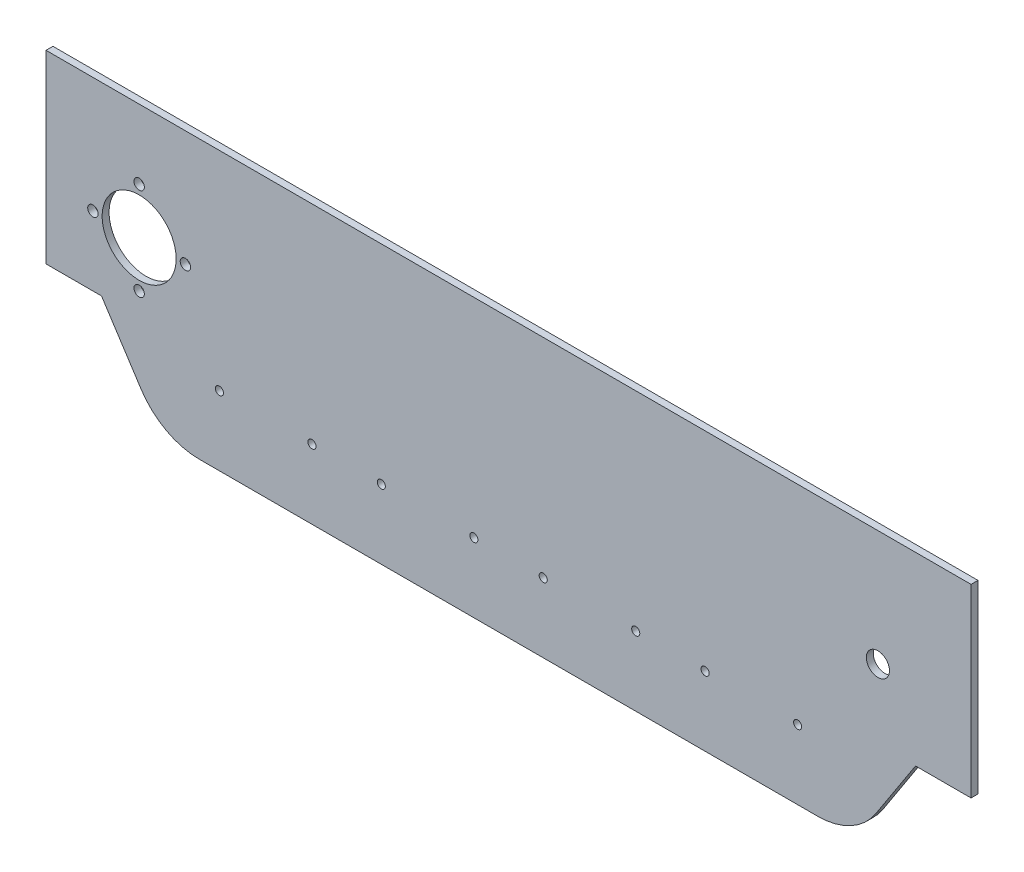
ISO-10303-21;
HEADER;
FILE_DESCRIPTION(('STEP AP214'),'2;1');
FILE_NAME('part.step','',(''),(''),'','','');
FILE_SCHEMA(('AUTOMOTIVE_DESIGN { 1 0 10303 214 1 1 1 1 }'));
ENDSEC;
DATA;
#1=APPLICATION_CONTEXT('core data for automotive mechanical design processes');
#2=APPLICATION_PROTOCOL_DEFINITION('international standard','automotive_design',2000,#1);
#3=PRODUCT_CONTEXT('',#1,'mechanical');
#4=PRODUCT('Part','Part','',(#3));
#5=PRODUCT_RELATED_PRODUCT_CATEGORY('part','',(#4));
#6=PRODUCT_DEFINITION_FORMATION('','',#4);
#7=PRODUCT_DEFINITION_CONTEXT('part definition',#1,'design');
#8=PRODUCT_DEFINITION('design','',#6,#7);
#9=PRODUCT_DEFINITION_SHAPE('','',#8);
#10=(LENGTH_UNIT() NAMED_UNIT(*) SI_UNIT(.MILLI.,.METRE.));
#11=(NAMED_UNIT(*) PLANE_ANGLE_UNIT() SI_UNIT($,.RADIAN.));
#12=(NAMED_UNIT(*) SI_UNIT($,.STERADIAN.) SOLID_ANGLE_UNIT());
#13=UNCERTAINTY_MEASURE_WITH_UNIT(LENGTH_MEASURE(1.E-05),#10,'distance_accuracy_value','');
#14=(GEOMETRIC_REPRESENTATION_CONTEXT(3) GLOBAL_UNCERTAINTY_ASSIGNED_CONTEXT((#13)) GLOBAL_UNIT_ASSIGNED_CONTEXT((#10,
#11,#12)) REPRESENTATION_CONTEXT('',''));
#15=CARTESIAN_POINT('',(0.,0.,0.));
#16=DIRECTION('',(0.,0.,1.));
#17=DIRECTION('',(1.,0.,0.));
#18=AXIS2_PLACEMENT_3D('',#15,#16,#17);
#19=CARTESIAN_POINT('',(399.872727163389,53.6503494821376,3.));
#20=DIRECTION('',(-0.838443616300637,0.544988350595414,0.));
#21=DIRECTION('',(-0.544988350595414,-0.838443616300637,0.));
#22=AXIS2_PLACEMENT_3D('',#19,#20,#21);
#23=PLANE('',#22);
#24=DIRECTION('',(0.,0.,1.));
#25=VECTOR('',#24,1.);
#26=CARTESIAN_POINT('',(391.,40.,0.));
#27=LINE('',#26,#25);
#28=CARTESIAN_POINT('',(391.,40.,0.));
#29=VERTEX_POINT('',#28);
#30=CARTESIAN_POINT('',(391.,40.,3.));
#31=VERTEX_POINT('',#30);
#32=EDGE_CURVE('E46',#29,#31,#27,.T.);
#33=ORIENTED_EDGE('',*,*,#32,.T.);
#34=DIRECTION('',(0.544988350595414,0.838443616300637,0.));
#35=VECTOR('',#34,1.);
#36=CARTESIAN_POINT('',(399.872727163389,53.6503494821376,3.));
#37=LINE('',#36,#35);
#38=CARTESIAN_POINT('',(373.872727163389,13.6503494821376,3.));
#39=VERTEX_POINT('',#38);
#40=EDGE_CURVE('E209',#39,#31,#37,.T.);
#41=ORIENTED_EDGE('',*,*,#40,.F.);
#42=DIRECTION('',(0.,0.,-1.));
#43=VECTOR('',#42,1.);
#44=CARTESIAN_POINT('',(373.872727163389,13.6503494821376,3.));
#45=LINE('',#44,#43);
#46=CARTESIAN_POINT('',(373.872727163389,13.6503494821376,0.));
#47=VERTEX_POINT('',#46);
#48=EDGE_CURVE('E211',#39,#47,#45,.T.);
#49=ORIENTED_EDGE('',*,*,#48,.T.);
#50=DIRECTION('',(0.544988350595414,0.838443616300637,0.));
#51=VECTOR('',#50,1.);
#52=CARTESIAN_POINT('',(399.872727163389,53.6503494821376,0.));
#53=LINE('',#52,#51);
#54=EDGE_CURVE('E203',#47,#29,#53,.T.);
#55=ORIENTED_EDGE('',*,*,#54,.T.);
#56=EDGE_LOOP('',(#33,#41,#49,#55));
#57=FACE_BOUND('',#56,.T.);
#58=ADVANCED_FACE('F31',(#57),#23,.F.);
#59=CARTESIAN_POINT('',(56.1272728366106,13.6503494821376,3.));
#60=DIRECTION('',(0.838443616300637,0.544988350595414,0.));
#61=DIRECTION('',(-0.544988350595414,0.838443616300637,0.));
#62=AXIS2_PLACEMENT_3D('',#59,#60,#61);
#63=PLANE('',#62);
#64=DIRECTION('',(0.544988350595414,-0.838443616300637,0.));
#65=VECTOR('',#64,1.);
#66=CARTESIAN_POINT('',(56.1272728366106,13.6503494821376,3.));
#67=LINE('',#66,#65);
#68=CARTESIAN_POINT('',(39.,40.,3.));
#69=VERTEX_POINT('',#68);
#70=CARTESIAN_POINT('',(56.1272728366106,13.6503494821376,3.));
#71=VERTEX_POINT('',#70);
#72=EDGE_CURVE('E54',#69,#71,#67,.T.);
#73=ORIENTED_EDGE('',*,*,#72,.F.);
#74=DIRECTION('',(0.,0.,1.));
#75=VECTOR('',#74,1.);
#76=CARTESIAN_POINT('',(38.9999999999999,40.0000000000001,0.));
#77=LINE('',#76,#75);
#78=CARTESIAN_POINT('',(38.9999999999999,40.0000000000001,0.));
#79=VERTEX_POINT('',#78);
#80=EDGE_CURVE('E157',#79,#69,#77,.T.);
#81=ORIENTED_EDGE('',*,*,#80,.F.);
#82=DIRECTION('',(0.544988350595414,-0.838443616300637,0.));
#83=VECTOR('',#82,1.);
#84=CARTESIAN_POINT('',(56.1272728366106,13.6503494821376,0.));
#85=LINE('',#84,#83);
#86=CARTESIAN_POINT('',(56.1272728366106,13.6503494821376,0.));
#87=VERTEX_POINT('',#86);
#88=EDGE_CURVE('E198',#79,#87,#85,.T.);
#89=ORIENTED_EDGE('',*,*,#88,.T.);
#90=DIRECTION('',(0.,0.,-1.));
#91=VECTOR('',#90,1.);
#92=CARTESIAN_POINT('',(56.1272728366106,13.6503494821376,3.));
#93=LINE('',#92,#91);
#94=EDGE_CURVE('E11',#71,#87,#93,.T.);
#95=ORIENTED_EDGE('',*,*,#94,.F.);
#96=EDGE_LOOP('',(#73,#81,#89,#95));
#97=FACE_BOUND('',#96,.T.);
#98=ADVANCED_FACE('F33',(#97),#63,.F.);
#99=CARTESIAN_POINT('',(81.2805813256297,30.,3.));
#100=DIRECTION('',(0.,0.,-1.));
#101=DIRECTION('',(-1.,0.,0.));
#102=AXIS2_PLACEMENT_3D('',#99,#100,#101);
#103=CYLINDRICAL_SURFACE('',#102,30.);
#104=CARTESIAN_POINT('',(81.2805813256297,30.,0.));
#105=DIRECTION('',(0.,0.,1.));
#106=DIRECTION('',(-1.,0.,0.));
#107=AXIS2_PLACEMENT_3D('',#104,#105,#106);
#108=CIRCLE('',#107,30.);
#109=CARTESIAN_POINT('',(81.2805813256297,0.,0.));
#110=VERTEX_POINT('',#109);
#111=EDGE_CURVE('E213',#87,#110,#108,.T.);
#112=ORIENTED_EDGE('',*,*,#111,.T.);
#113=DIRECTION('',(0.,0.,-1.));
#114=VECTOR('',#113,1.);
#115=CARTESIAN_POINT('',(81.2805813256297,0.,3.));
#116=LINE('',#115,#114);
#117=CARTESIAN_POINT('',(81.2805813256297,0.,3.));
#118=VERTEX_POINT('',#117);
#119=EDGE_CURVE('E39',#118,#110,#116,.T.);
#120=ORIENTED_EDGE('',*,*,#119,.F.);
#121=CARTESIAN_POINT('',(81.2805813256297,30.,3.));
#122=DIRECTION('',(0.,0.,1.));
#123=DIRECTION('',(-1.,0.,0.));
#124=AXIS2_PLACEMENT_3D('',#121,#122,#123);
#125=CIRCLE('',#124,30.);
#126=EDGE_CURVE('E202',#71,#118,#125,.T.);
#127=ORIENTED_EDGE('',*,*,#126,.F.);
#128=ORIENTED_EDGE('',*,*,#94,.T.);
#129=EDGE_LOOP('',(#112,#120,#127,#128));
#130=FACE_BOUND('',#129,.T.);
#131=ADVANCED_FACE('F241',(#130),#103,.T.);
#132=CARTESIAN_POINT('',(348.71941867437,0.,3.));
#133=DIRECTION('',(0.,1.,0.));
#134=DIRECTION('',(0.,0.,1.));
#135=AXIS2_PLACEMENT_3D('',#132,#133,#134);
#136=PLANE('',#135);
#137=DIRECTION('',(1.,0.,0.));
#138=VECTOR('',#137,1.);
#139=CARTESIAN_POINT('',(348.71941867437,0.,0.));
#140=LINE('',#139,#138);
#141=CARTESIAN_POINT('',(348.71941867437,0.,0.));
#142=VERTEX_POINT('',#141);
#143=EDGE_CURVE('E215',#110,#142,#140,.T.);
#144=ORIENTED_EDGE('',*,*,#143,.T.);
#145=DIRECTION('',(0.,0.,-1.));
#146=VECTOR('',#145,1.);
#147=CARTESIAN_POINT('',(348.71941867437,0.,3.));
#148=LINE('',#147,#146);
#149=CARTESIAN_POINT('',(348.71941867437,0.,3.));
#150=VERTEX_POINT('',#149);
#151=EDGE_CURVE('E222',#150,#142,#148,.T.);
#152=ORIENTED_EDGE('',*,*,#151,.F.);
#153=DIRECTION('',(1.,0.,0.));
#154=VECTOR('',#153,1.);
#155=CARTESIAN_POINT('',(348.71941867437,0.,3.));
#156=LINE('',#155,#154);
#157=EDGE_CURVE('E205',#118,#150,#156,.T.);
#158=ORIENTED_EDGE('',*,*,#157,.F.);
#159=ORIENTED_EDGE('',*,*,#119,.T.);
#160=EDGE_LOOP('',(#144,#152,#158,#159));
#161=FACE_BOUND('',#160,.T.);
#162=ADVANCED_FACE('F229',(#161),#136,.F.);
#163=CARTESIAN_POINT('',(348.71941867437,30.,3.));
#164=DIRECTION('',(0.,0.,-1.));
#165=DIRECTION('',(-1.,0.,0.));
#166=AXIS2_PLACEMENT_3D('',#163,#164,#165);
#167=CYLINDRICAL_SURFACE('',#166,30.);
#168=CARTESIAN_POINT('',(348.71941867437,30.,0.));
#169=DIRECTION('',(0.,0.,1.));
#170=DIRECTION('',(-1.,0.,0.));
#171=AXIS2_PLACEMENT_3D('',#168,#169,#170);
#172=CIRCLE('',#171,30.);
#173=EDGE_CURVE('E217',#142,#47,#172,.T.);
#174=ORIENTED_EDGE('',*,*,#173,.T.);
#175=ORIENTED_EDGE('',*,*,#48,.F.);
#176=CARTESIAN_POINT('',(348.71941867437,30.,3.));
#177=DIRECTION('',(0.,0.,1.));
#178=DIRECTION('',(-1.,0.,0.));
#179=AXIS2_PLACEMENT_3D('',#176,#177,#178);
#180=CIRCLE('',#179,30.);
#181=EDGE_CURVE('E207',#150,#39,#180,.T.);
#182=ORIENTED_EDGE('',*,*,#181,.F.);
#183=ORIENTED_EDGE('',*,*,#151,.T.);
#184=EDGE_LOOP('',(#174,#175,#182,#183));
#185=FACE_BOUND('',#184,.T.);
#186=ADVANCED_FACE('F237',(#185),#167,.T.);
#187=CARTESIAN_POINT('',(55.2805813256297,70.,3.));
#188=DIRECTION('',(0.,0.,1.));
#189=DIRECTION('',(1.,0.,0.));
#190=AXIS2_PLACEMENT_3D('',#187,#188,#189);
#191=PLANE('',#190);
#192=CARTESIAN_POINT('',(300.,30.,3.));
#193=DIRECTION('',(0.,0.,1.));
#194=DIRECTION('',(1.,0.,0.));
#195=AXIS2_PLACEMENT_3D('',#192,#193,#194);
#196=CIRCLE('',#195,1.75);
#197=CARTESIAN_POINT('',(301.75,30.,3.));
#198=VERTEX_POINT('',#197);
#199=EDGE_CURVE('E462',#198,#198,#196,.T.);
#200=ORIENTED_EDGE('',*,*,#199,.F.);
#201=EDGE_LOOP('',(#200));
#202=FACE_BOUND('',#201,.T.);
#203=CARTESIAN_POINT('',(340.,30.,3.));
#204=DIRECTION('',(0.,0.,1.));
#205=DIRECTION('',(1.,0.,0.));
#206=AXIS2_PLACEMENT_3D('',#203,#204,#205);
#207=CIRCLE('',#206,1.75000000000001);
#208=CARTESIAN_POINT('',(341.75,30.,3.));
#209=VERTEX_POINT('',#208);
#210=EDGE_CURVE('E464',#209,#209,#207,.T.);
#211=ORIENTED_EDGE('',*,*,#210,.F.);
#212=EDGE_LOOP('',(#211));
#213=FACE_BOUND('',#212,.T.);
#214=CARTESIAN_POINT('',(230.,30.,3.));
#215=DIRECTION('',(0.,0.,1.));
#216=DIRECTION('',(1.,0.,0.));
#217=AXIS2_PLACEMENT_3D('',#214,#215,#216);
#218=CIRCLE('',#217,1.75);
#219=CARTESIAN_POINT('',(231.75,30.,3.));
#220=VERTEX_POINT('',#219);
#221=EDGE_CURVE('E470',#220,#220,#218,.T.);
#222=ORIENTED_EDGE('',*,*,#221,.F.);
#223=EDGE_LOOP('',(#222));
#224=FACE_BOUND('',#223,.T.);
#225=CARTESIAN_POINT('',(270.,30.,3.));
#226=DIRECTION('',(0.,0.,1.));
#227=DIRECTION('',(1.,0.,0.));
#228=AXIS2_PLACEMENT_3D('',#225,#226,#227);
#229=CIRCLE('',#228,1.75000000000001);
#230=CARTESIAN_POINT('',(271.75,30.,3.));
#231=VERTEX_POINT('',#230);
#232=EDGE_CURVE('E476',#231,#231,#229,.T.);
#233=ORIENTED_EDGE('',*,*,#232,.F.);
#234=EDGE_LOOP('',(#233));
#235=FACE_BOUND('',#234,.T.);
#236=CARTESIAN_POINT('',(160.,30.,3.));
#237=DIRECTION('',(0.,0.,1.));
#238=DIRECTION('',(1.,0.,0.));
#239=AXIS2_PLACEMENT_3D('',#236,#237,#238);
#240=CIRCLE('',#239,1.75);
#241=CARTESIAN_POINT('',(161.75,30.,3.));
#242=VERTEX_POINT('',#241);
#243=EDGE_CURVE('E482',#242,#242,#240,.T.);
#244=ORIENTED_EDGE('',*,*,#243,.F.);
#245=EDGE_LOOP('',(#244));
#246=FACE_BOUND('',#245,.T.);
#247=CARTESIAN_POINT('',(200.,30.,3.));
#248=DIRECTION('',(0.,0.,1.));
#249=DIRECTION('',(1.,0.,0.));
#250=AXIS2_PLACEMENT_3D('',#247,#248,#249);
#251=CIRCLE('',#250,1.75000000000001);
#252=CARTESIAN_POINT('',(201.75,30.,3.));
#253=VERTEX_POINT('',#252);
#254=EDGE_CURVE('E488',#253,#253,#251,.T.);
#255=ORIENTED_EDGE('',*,*,#254,.F.);
#256=EDGE_LOOP('',(#255));
#257=FACE_BOUND('',#256,.T.);
#258=CARTESIAN_POINT('',(90.,30.,3.));
#259=DIRECTION('',(0.,0.,1.));
#260=DIRECTION('',(1.,0.,0.));
#261=AXIS2_PLACEMENT_3D('',#258,#259,#260);
#262=CIRCLE('',#261,1.75);
#263=CARTESIAN_POINT('',(91.75,30.,3.));
#264=VERTEX_POINT('',#263);
#265=EDGE_CURVE('E494',#264,#264,#262,.T.);
#266=ORIENTED_EDGE('',*,*,#265,.F.);
#267=EDGE_LOOP('',(#266));
#268=FACE_BOUND('',#267,.T.);
#269=CARTESIAN_POINT('',(130.,30.,3.));
#270=DIRECTION('',(0.,0.,1.));
#271=DIRECTION('',(1.,0.,0.));
#272=AXIS2_PLACEMENT_3D('',#269,#270,#271);
#273=CIRCLE('',#272,1.75000000000001);
#274=CARTESIAN_POINT('',(131.75,30.,3.));
#275=VERTEX_POINT('',#274);
#276=EDGE_CURVE('E140',#275,#275,#273,.T.);
#277=ORIENTED_EDGE('',*,*,#276,.F.);
#278=EDGE_LOOP('',(#277));
#279=FACE_BOUND('',#278,.T.);
#280=CARTESIAN_POINT('',(374.71941867437,70.,3.));
#281=DIRECTION('',(0.,0.,1.));
#282=DIRECTION('',(1.,0.,0.));
#283=AXIS2_PLACEMENT_3D('',#280,#281,#282);
#284=CIRCLE('',#283,4.99999999999999);
#285=CARTESIAN_POINT('',(379.71941867437,70.,3.));
#286=VERTEX_POINT('',#285);
#287=EDGE_CURVE('E156',#286,#286,#284,.T.);
#288=ORIENTED_EDGE('',*,*,#287,.F.);
#289=EDGE_LOOP('',(#288));
#290=FACE_BOUND('',#289,.T.);
#291=CARTESIAN_POINT('',(35.2805813256297,70.,3.));
#292=DIRECTION('',(0.,0.,1.));
#293=DIRECTION('',(1.,0.,0.));
#294=AXIS2_PLACEMENT_3D('',#291,#292,#293);
#295=CIRCLE('',#294,2.25);
#296=CARTESIAN_POINT('',(37.5305813256297,70.,3.));
#297=VERTEX_POINT('',#296);
#298=EDGE_CURVE('E168',#297,#297,#295,.T.);
#299=ORIENTED_EDGE('',*,*,#298,.F.);
#300=EDGE_LOOP('',(#299));
#301=FACE_BOUND('',#300,.T.);
#302=CARTESIAN_POINT('',(55.2805813256297,50.,3.));
#303=DIRECTION('',(0.,0.,1.));
#304=DIRECTION('',(1.,0.,0.));
#305=AXIS2_PLACEMENT_3D('',#302,#303,#304);
#306=CIRCLE('',#305,2.25);
#307=CARTESIAN_POINT('',(57.5305813256297,50.,3.));
#308=VERTEX_POINT('',#307);
#309=EDGE_CURVE('E174',#308,#308,#306,.T.);
#310=ORIENTED_EDGE('',*,*,#309,.F.);
#311=EDGE_LOOP('',(#310));
#312=FACE_BOUND('',#311,.T.);
#313=CARTESIAN_POINT('',(75.2805813256297,70.,3.));
#314=DIRECTION('',(0.,0.,1.));
#315=DIRECTION('',(1.,0.,0.));
#316=AXIS2_PLACEMENT_3D('',#313,#314,#315);
#317=CIRCLE('',#316,2.25);
#318=CARTESIAN_POINT('',(77.5305813256297,70.,3.));
#319=VERTEX_POINT('',#318);
#320=EDGE_CURVE('E180',#319,#319,#317,.T.);
#321=ORIENTED_EDGE('',*,*,#320,.F.);
#322=EDGE_LOOP('',(#321));
#323=FACE_BOUND('',#322,.T.);
#324=CARTESIAN_POINT('',(55.2805813256297,90.,3.));
#325=DIRECTION('',(0.,0.,1.));
#326=DIRECTION('',(1.,0.,0.));
#327=AXIS2_PLACEMENT_3D('',#324,#325,#326);
#328=CIRCLE('',#327,2.25);
#329=CARTESIAN_POINT('',(57.5305813256297,90.,3.));
#330=VERTEX_POINT('',#329);
#331=EDGE_CURVE('E186',#330,#330,#328,.T.);
#332=ORIENTED_EDGE('',*,*,#331,.F.);
#333=EDGE_LOOP('',(#332));
#334=FACE_BOUND('',#333,.T.);
#335=CARTESIAN_POINT('',(55.2805813256297,70.,3.));
#336=DIRECTION('',(0.,0.,1.));
#337=DIRECTION('',(1.,0.,0.));
#338=AXIS2_PLACEMENT_3D('',#335,#336,#337);
#339=CIRCLE('',#338,16.);
#340=CARTESIAN_POINT('',(71.2805813256297,70.,3.));
#341=VERTEX_POINT('',#340);
#342=EDGE_CURVE('E192',#341,#341,#339,.T.);
#343=ORIENTED_EDGE('',*,*,#342,.F.);
#344=EDGE_LOOP('',(#343));
#345=FACE_BOUND('',#344,.T.);
#346=ORIENTED_EDGE('',*,*,#40,.T.);
#347=DIRECTION('',(-1.,0.,0.));
#348=VECTOR('',#347,1.);
#349=CARTESIAN_POINT('',(215.,39.9999999999999,3.));
#350=LINE('',#349,#348);
#351=CARTESIAN_POINT('',(415.,39.9999999999999,3.));
#352=VERTEX_POINT('',#351);
#353=EDGE_CURVE('E148',#352,#31,#350,.T.);
#354=ORIENTED_EDGE('',*,*,#353,.F.);
#355=DIRECTION('',(0.,-1.,0.));
#356=VECTOR('',#355,1.);
#357=CARTESIAN_POINT('',(415.,-264.967528681372,3.));
#358=LINE('',#357,#356);
#359=CARTESIAN_POINT('',(415.,120.,3.));
#360=VERTEX_POINT('',#359);
#361=EDGE_CURVE('E126',#360,#352,#358,.T.);
#362=ORIENTED_EDGE('',*,*,#361,.F.);
#363=DIRECTION('',(1.,0.,0.));
#364=VECTOR('',#363,1.);
#365=CARTESIAN_POINT('',(215.,120.,3.));
#366=LINE('',#365,#364);
#367=CARTESIAN_POINT('',(15.,120.,3.));
#368=VERTEX_POINT('',#367);
#369=EDGE_CURVE('E152',#368,#360,#366,.T.);
#370=ORIENTED_EDGE('',*,*,#369,.F.);
#371=DIRECTION('',(0.,1.,0.));
#372=VECTOR('',#371,1.);
#373=CARTESIAN_POINT('',(15.0000000000001,-264.967528681372,3.));
#374=LINE('',#373,#372);
#375=CARTESIAN_POINT('',(15.,39.9999999999999,3.));
#376=VERTEX_POINT('',#375);
#377=EDGE_CURVE('E137',#376,#368,#374,.T.);
#378=ORIENTED_EDGE('',*,*,#377,.F.);
#379=DIRECTION('',(1.,0.,0.));
#380=VECTOR('',#379,1.);
#381=CARTESIAN_POINT('',(215.,40.,3.));
#382=LINE('',#381,#380);
#383=EDGE_CURVE('E134',#376,#69,#382,.T.);
#384=ORIENTED_EDGE('',*,*,#383,.T.);
#385=ORIENTED_EDGE('',*,*,#72,.T.);
#386=ORIENTED_EDGE('',*,*,#126,.T.);
#387=ORIENTED_EDGE('',*,*,#157,.T.);
#388=ORIENTED_EDGE('',*,*,#181,.T.);
#389=EDGE_LOOP('',(#346,#354,#362,#370,#378,#384,#385,#386,#387,#388));
#390=FACE_BOUND('',#389,.T.);
#391=ADVANCED_FACE('F240',(#202,#213,#224,#235,#246,#257,#268,#279,#290,#301,#312,#323,#334,
#345,#390),#191,.T.);
#392=CARTESIAN_POINT('',(55.2805813256297,70.,0.));
#393=DIRECTION('',(0.,0.,1.));
#394=DIRECTION('',(1.,0.,0.));
#395=AXIS2_PLACEMENT_3D('',#392,#393,#394);
#396=PLANE('',#395);
#397=CARTESIAN_POINT('',(300.,30.,0.));
#398=DIRECTION('',(0.,0.,1.));
#399=DIRECTION('',(1.,0.,0.));
#400=AXIS2_PLACEMENT_3D('',#397,#398,#399);
#401=CIRCLE('',#400,1.75);
#402=CARTESIAN_POINT('',(301.75,30.,0.));
#403=VERTEX_POINT('',#402);
#404=EDGE_CURVE('E459',#403,#403,#401,.T.);
#405=ORIENTED_EDGE('',*,*,#404,.T.);
#406=EDGE_LOOP('',(#405));
#407=FACE_BOUND('',#406,.T.);
#408=CARTESIAN_POINT('',(340.,30.,0.));
#409=DIRECTION('',(0.,0.,1.));
#410=DIRECTION('',(1.,0.,0.));
#411=AXIS2_PLACEMENT_3D('',#408,#409,#410);
#412=CIRCLE('',#411,1.75000000000001);
#413=CARTESIAN_POINT('',(341.75,30.,0.));
#414=VERTEX_POINT('',#413);
#415=EDGE_CURVE('E467',#414,#414,#412,.T.);
#416=ORIENTED_EDGE('',*,*,#415,.T.);
#417=EDGE_LOOP('',(#416));
#418=FACE_BOUND('',#417,.T.);
#419=CARTESIAN_POINT('',(230.,30.,0.));
#420=DIRECTION('',(0.,0.,1.));
#421=DIRECTION('',(1.,0.,0.));
#422=AXIS2_PLACEMENT_3D('',#419,#420,#421);
#423=CIRCLE('',#422,1.75);
#424=CARTESIAN_POINT('',(231.75,30.,0.));
#425=VERTEX_POINT('',#424);
#426=EDGE_CURVE('E473',#425,#425,#423,.T.);
#427=ORIENTED_EDGE('',*,*,#426,.T.);
#428=EDGE_LOOP('',(#427));
#429=FACE_BOUND('',#428,.T.);
#430=CARTESIAN_POINT('',(270.,30.,0.));
#431=DIRECTION('',(0.,0.,1.));
#432=DIRECTION('',(1.,0.,0.));
#433=AXIS2_PLACEMENT_3D('',#430,#431,#432);
#434=CIRCLE('',#433,1.75000000000001);
#435=CARTESIAN_POINT('',(271.75,30.,0.));
#436=VERTEX_POINT('',#435);
#437=EDGE_CURVE('E479',#436,#436,#434,.T.);
#438=ORIENTED_EDGE('',*,*,#437,.T.);
#439=EDGE_LOOP('',(#438));
#440=FACE_BOUND('',#439,.T.);
#441=CARTESIAN_POINT('',(160.,30.,0.));
#442=DIRECTION('',(0.,0.,1.));
#443=DIRECTION('',(1.,0.,0.));
#444=AXIS2_PLACEMENT_3D('',#441,#442,#443);
#445=CIRCLE('',#444,1.75);
#446=CARTESIAN_POINT('',(161.75,30.,0.));
#447=VERTEX_POINT('',#446);
#448=EDGE_CURVE('E485',#447,#447,#445,.T.);
#449=ORIENTED_EDGE('',*,*,#448,.T.);
#450=EDGE_LOOP('',(#449));
#451=FACE_BOUND('',#450,.T.);
#452=CARTESIAN_POINT('',(200.,30.,0.));
#453=DIRECTION('',(0.,0.,1.));
#454=DIRECTION('',(1.,0.,0.));
#455=AXIS2_PLACEMENT_3D('',#452,#453,#454);
#456=CIRCLE('',#455,1.75000000000001);
#457=CARTESIAN_POINT('',(201.75,30.,0.));
#458=VERTEX_POINT('',#457);
#459=EDGE_CURVE('E491',#458,#458,#456,.T.);
#460=ORIENTED_EDGE('',*,*,#459,.T.);
#461=EDGE_LOOP('',(#460));
#462=FACE_BOUND('',#461,.T.);
#463=CARTESIAN_POINT('',(90.,30.,0.));
#464=DIRECTION('',(0.,0.,1.));
#465=DIRECTION('',(1.,0.,0.));
#466=AXIS2_PLACEMENT_3D('',#463,#464,#465);
#467=CIRCLE('',#466,1.75);
#468=CARTESIAN_POINT('',(91.75,30.,0.));
#469=VERTEX_POINT('',#468);
#470=EDGE_CURVE('E497',#469,#469,#467,.T.);
#471=ORIENTED_EDGE('',*,*,#470,.T.);
#472=EDGE_LOOP('',(#471));
#473=FACE_BOUND('',#472,.T.);
#474=CARTESIAN_POINT('',(130.,30.,0.));
#475=DIRECTION('',(0.,0.,1.));
#476=DIRECTION('',(1.,0.,0.));
#477=AXIS2_PLACEMENT_3D('',#474,#475,#476);
#478=CIRCLE('',#477,1.75000000000001);
#479=CARTESIAN_POINT('',(131.75,30.,0.));
#480=VERTEX_POINT('',#479);
#481=EDGE_CURVE('E150',#480,#480,#478,.T.);
#482=ORIENTED_EDGE('',*,*,#481,.T.);
#483=EDGE_LOOP('',(#482));
#484=FACE_BOUND('',#483,.T.);
#485=CARTESIAN_POINT('',(374.71941867437,70.,0.));
#486=DIRECTION('',(0.,0.,1.));
#487=DIRECTION('',(1.,0.,0.));
#488=AXIS2_PLACEMENT_3D('',#485,#486,#487);
#489=CIRCLE('',#488,4.99999999999999);
#490=CARTESIAN_POINT('',(379.71941867437,70.,0.));
#491=VERTEX_POINT('',#490);
#492=EDGE_CURVE('E165',#491,#491,#489,.T.);
#493=ORIENTED_EDGE('',*,*,#492,.T.);
#494=EDGE_LOOP('',(#493));
#495=FACE_BOUND('',#494,.T.);
#496=CARTESIAN_POINT('',(35.2805813256297,70.,0.));
#497=DIRECTION('',(0.,0.,1.));
#498=DIRECTION('',(1.,0.,0.));
#499=AXIS2_PLACEMENT_3D('',#496,#497,#498);
#500=CIRCLE('',#499,2.25);
#501=CARTESIAN_POINT('',(37.5305813256297,70.,0.));
#502=VERTEX_POINT('',#501);
#503=EDGE_CURVE('E171',#502,#502,#500,.T.);
#504=ORIENTED_EDGE('',*,*,#503,.T.);
#505=EDGE_LOOP('',(#504));
#506=FACE_BOUND('',#505,.T.);
#507=CARTESIAN_POINT('',(55.2805813256297,50.,0.));
#508=DIRECTION('',(0.,0.,1.));
#509=DIRECTION('',(1.,0.,0.));
#510=AXIS2_PLACEMENT_3D('',#507,#508,#509);
#511=CIRCLE('',#510,2.25);
#512=CARTESIAN_POINT('',(57.5305813256297,50.,0.));
#513=VERTEX_POINT('',#512);
#514=EDGE_CURVE('E177',#513,#513,#511,.T.);
#515=ORIENTED_EDGE('',*,*,#514,.T.);
#516=EDGE_LOOP('',(#515));
#517=FACE_BOUND('',#516,.T.);
#518=CARTESIAN_POINT('',(75.2805813256297,70.,0.));
#519=DIRECTION('',(0.,0.,1.));
#520=DIRECTION('',(1.,0.,0.));
#521=AXIS2_PLACEMENT_3D('',#518,#519,#520);
#522=CIRCLE('',#521,2.25);
#523=CARTESIAN_POINT('',(77.5305813256297,70.,0.));
#524=VERTEX_POINT('',#523);
#525=EDGE_CURVE('E183',#524,#524,#522,.T.);
#526=ORIENTED_EDGE('',*,*,#525,.T.);
#527=EDGE_LOOP('',(#526));
#528=FACE_BOUND('',#527,.T.);
#529=CARTESIAN_POINT('',(55.2805813256297,90.,0.));
#530=DIRECTION('',(0.,0.,1.));
#531=DIRECTION('',(1.,0.,0.));
#532=AXIS2_PLACEMENT_3D('',#529,#530,#531);
#533=CIRCLE('',#532,2.25);
#534=CARTESIAN_POINT('',(57.5305813256297,90.,0.));
#535=VERTEX_POINT('',#534);
#536=EDGE_CURVE('E189',#535,#535,#533,.T.);
#537=ORIENTED_EDGE('',*,*,#536,.T.);
#538=EDGE_LOOP('',(#537));
#539=FACE_BOUND('',#538,.T.);
#540=CARTESIAN_POINT('',(55.2805813256297,70.,0.));
#541=DIRECTION('',(0.,0.,1.));
#542=DIRECTION('',(1.,0.,0.));
#543=AXIS2_PLACEMENT_3D('',#540,#541,#542);
#544=CIRCLE('',#543,16.);
#545=CARTESIAN_POINT('',(71.2805813256297,70.,0.));
#546=VERTEX_POINT('',#545);
#547=EDGE_CURVE('E195',#546,#546,#544,.T.);
#548=ORIENTED_EDGE('',*,*,#547,.T.);
#549=EDGE_LOOP('',(#548));
#550=FACE_BOUND('',#549,.T.);
#551=DIRECTION('',(-1.,0.,0.));
#552=VECTOR('',#551,1.);
#553=CARTESIAN_POINT('',(215.,39.9999999999999,0.));
#554=LINE('',#553,#552);
#555=CARTESIAN_POINT('',(415.,39.9999999999999,0.));
#556=VERTEX_POINT('',#555);
#557=EDGE_CURVE('E115',#556,#29,#554,.T.);
#558=ORIENTED_EDGE('',*,*,#557,.T.);
#559=ORIENTED_EDGE('',*,*,#54,.F.);
#560=ORIENTED_EDGE('',*,*,#173,.F.);
#561=ORIENTED_EDGE('',*,*,#143,.F.);
#562=ORIENTED_EDGE('',*,*,#111,.F.);
#563=ORIENTED_EDGE('',*,*,#88,.F.);
#564=DIRECTION('',(1.,0.,0.));
#565=VECTOR('',#564,1.);
#566=CARTESIAN_POINT('',(215.,40.,0.));
#567=LINE('',#566,#565);
#568=CARTESIAN_POINT('',(15.,39.9999999999999,0.));
#569=VERTEX_POINT('',#568);
#570=EDGE_CURVE('E131',#569,#79,#567,.T.);
#571=ORIENTED_EDGE('',*,*,#570,.F.);
#572=DIRECTION('',(0.,1.,0.));
#573=VECTOR('',#572,1.);
#574=CARTESIAN_POINT('',(15.0000000000001,-264.967528681372,0.));
#575=LINE('',#574,#573);
#576=CARTESIAN_POINT('',(15.,120.,0.));
#577=VERTEX_POINT('',#576);
#578=EDGE_CURVE('E144',#569,#577,#575,.T.);
#579=ORIENTED_EDGE('',*,*,#578,.T.);
#580=DIRECTION('',(1.,0.,0.));
#581=VECTOR('',#580,1.);
#582=CARTESIAN_POINT('',(215.,120.,0.));
#583=LINE('',#582,#581);
#584=CARTESIAN_POINT('',(415.,120.,0.));
#585=VERTEX_POINT('',#584);
#586=EDGE_CURVE('E117',#577,#585,#583,.T.);
#587=ORIENTED_EDGE('',*,*,#586,.T.);
#588=DIRECTION('',(0.,-1.,0.));
#589=VECTOR('',#588,1.);
#590=CARTESIAN_POINT('',(415.,-264.967528681372,0.));
#591=LINE('',#590,#589);
#592=EDGE_CURVE('E110',#585,#556,#591,.T.);
#593=ORIENTED_EDGE('',*,*,#592,.T.);
#594=EDGE_LOOP('',(#558,#559,#560,#561,#562,#563,#571,#579,#587,#593));
#595=FACE_BOUND('',#594,.T.);
#596=ADVANCED_FACE('F112',(#407,#418,#429,#440,#451,#462,#473,#484,#495,#506,#517,#528,#539,
#550,#595),#396,.F.);
#597=CARTESIAN_POINT('',(55.2805813256297,70.,0.));
#598=DIRECTION('',(0.,0.,1.));
#599=DIRECTION('',(1.,0.,0.));
#600=AXIS2_PLACEMENT_3D('',#597,#598,#599);
#601=CYLINDRICAL_SURFACE('',#600,16.);
#602=ORIENTED_EDGE('',*,*,#547,.F.);
#603=EDGE_LOOP('',(#602));
#604=FACE_BOUND('',#603,.T.);
#605=ORIENTED_EDGE('',*,*,#342,.T.);
#606=EDGE_LOOP('',(#605));
#607=FACE_BOUND('',#606,.T.);
#608=ADVANCED_FACE('F301',(#604,#607),#601,.F.);
#609=CARTESIAN_POINT('',(55.2805813256297,90.,0.));
#610=DIRECTION('',(0.,0.,1.));
#611=DIRECTION('',(1.,0.,0.));
#612=AXIS2_PLACEMENT_3D('',#609,#610,#611);
#613=CYLINDRICAL_SURFACE('',#612,2.25);
#614=ORIENTED_EDGE('',*,*,#536,.F.);
#615=EDGE_LOOP('',(#614));
#616=FACE_BOUND('',#615,.T.);
#617=ORIENTED_EDGE('',*,*,#331,.T.);
#618=EDGE_LOOP('',(#617));
#619=FACE_BOUND('',#618,.T.);
#620=ADVANCED_FACE('F308',(#616,#619),#613,.F.);
#621=CARTESIAN_POINT('',(75.2805813256297,70.,0.));
#622=DIRECTION('',(0.,0.,1.));
#623=DIRECTION('',(1.,0.,0.));
#624=AXIS2_PLACEMENT_3D('',#621,#622,#623);
#625=CYLINDRICAL_SURFACE('',#624,2.25);
#626=ORIENTED_EDGE('',*,*,#525,.F.);
#627=EDGE_LOOP('',(#626));
#628=FACE_BOUND('',#627,.T.);
#629=ORIENTED_EDGE('',*,*,#320,.T.);
#630=EDGE_LOOP('',(#629));
#631=FACE_BOUND('',#630,.T.);
#632=ADVANCED_FACE('F316',(#628,#631),#625,.F.);
#633=CARTESIAN_POINT('',(55.2805813256297,50.,0.));
#634=DIRECTION('',(0.,0.,1.));
#635=DIRECTION('',(1.,0.,0.));
#636=AXIS2_PLACEMENT_3D('',#633,#634,#635);
#637=CYLINDRICAL_SURFACE('',#636,2.25);
#638=ORIENTED_EDGE('',*,*,#514,.F.);
#639=EDGE_LOOP('',(#638));
#640=FACE_BOUND('',#639,.T.);
#641=ORIENTED_EDGE('',*,*,#309,.T.);
#642=EDGE_LOOP('',(#641));
#643=FACE_BOUND('',#642,.T.);
#644=ADVANCED_FACE('F324',(#640,#643),#637,.F.);
#645=CARTESIAN_POINT('',(35.2805813256297,70.,0.));
#646=DIRECTION('',(0.,0.,1.));
#647=DIRECTION('',(1.,0.,0.));
#648=AXIS2_PLACEMENT_3D('',#645,#646,#647);
#649=CYLINDRICAL_SURFACE('',#648,2.25);
#650=ORIENTED_EDGE('',*,*,#503,.F.);
#651=EDGE_LOOP('',(#650));
#652=FACE_BOUND('',#651,.T.);
#653=ORIENTED_EDGE('',*,*,#298,.T.);
#654=EDGE_LOOP('',(#653));
#655=FACE_BOUND('',#654,.T.);
#656=ADVANCED_FACE('F332',(#652,#655),#649,.F.);
#657=CARTESIAN_POINT('',(374.71941867437,70.,0.));
#658=DIRECTION('',(0.,0.,1.));
#659=DIRECTION('',(1.,0.,0.));
#660=AXIS2_PLACEMENT_3D('',#657,#658,#659);
#661=CYLINDRICAL_SURFACE('',#660,4.99999999999999);
#662=ORIENTED_EDGE('',*,*,#492,.F.);
#663=EDGE_LOOP('',(#662));
#664=FACE_BOUND('',#663,.T.);
#665=ORIENTED_EDGE('',*,*,#287,.T.);
#666=EDGE_LOOP('',(#665));
#667=FACE_BOUND('',#666,.T.);
#668=ADVANCED_FACE('F340',(#664,#667),#661,.F.);
#669=CARTESIAN_POINT('',(215.,39.9999999999999,0.));
#670=DIRECTION('',(0.,1.,0.));
#671=DIRECTION('',(-1.,0.,0.));
#672=AXIS2_PLACEMENT_3D('',#669,#670,#671);
#673=PLANE('',#672);
#674=ORIENTED_EDGE('',*,*,#353,.T.);
#675=ORIENTED_EDGE('',*,*,#32,.F.);
#676=ORIENTED_EDGE('',*,*,#557,.F.);
#677=DIRECTION('',(0.,0.,1.));
#678=VECTOR('',#677,1.);
#679=CARTESIAN_POINT('',(415.,39.9999999999999,0.));
#680=LINE('',#679,#678);
#681=EDGE_CURVE('E123',#556,#352,#680,.T.);
#682=ORIENTED_EDGE('',*,*,#681,.T.);
#683=EDGE_LOOP('',(#674,#675,#676,#682));
#684=FACE_BOUND('',#683,.T.);
#685=ADVANCED_FACE('F133',(#684),#673,.F.);
#686=CARTESIAN_POINT('',(215.,40.,0.));
#687=DIRECTION('',(0.,-1.,0.));
#688=DIRECTION('',(0.,0.,-1.));
#689=AXIS2_PLACEMENT_3D('',#686,#687,#688);
#690=PLANE('',#689);
#691=ORIENTED_EDGE('',*,*,#383,.F.);
#692=DIRECTION('',(0.,0.,1.));
#693=VECTOR('',#692,1.);
#694=CARTESIAN_POINT('',(15.,39.9999999999999,0.));
#695=LINE('',#694,#693);
#696=EDGE_CURVE('E159',#569,#376,#695,.T.);
#697=ORIENTED_EDGE('',*,*,#696,.F.);
#698=ORIENTED_EDGE('',*,*,#570,.T.);
#699=ORIENTED_EDGE('',*,*,#80,.T.);
#700=EDGE_LOOP('',(#691,#697,#698,#699));
#701=FACE_BOUND('',#700,.T.);
#702=ADVANCED_FACE('F247',(#701),#690,.T.);
#703=CARTESIAN_POINT('',(15.0000000000001,-264.967528681372,0.));
#704=DIRECTION('',(1.,0.,0.));
#705=DIRECTION('',(0.,1.,0.));
#706=AXIS2_PLACEMENT_3D('',#703,#704,#705);
#707=PLANE('',#706);
#708=ORIENTED_EDGE('',*,*,#377,.T.);
#709=DIRECTION('',(0.,0.,1.));
#710=VECTOR('',#709,1.);
#711=CARTESIAN_POINT('',(15.,120.,0.));
#712=LINE('',#711,#710);
#713=EDGE_CURVE('E161',#577,#368,#712,.T.);
#714=ORIENTED_EDGE('',*,*,#713,.F.);
#715=ORIENTED_EDGE('',*,*,#578,.F.);
#716=ORIENTED_EDGE('',*,*,#696,.T.);
#717=EDGE_LOOP('',(#708,#714,#715,#716));
#718=FACE_BOUND('',#717,.T.);
#719=ADVANCED_FACE('F250',(#718),#707,.F.);
#720=CARTESIAN_POINT('',(215.,120.,0.));
#721=DIRECTION('',(0.,-1.,0.));
#722=DIRECTION('',(0.,0.,-1.));
#723=AXIS2_PLACEMENT_3D('',#720,#721,#722);
#724=PLANE('',#723);
#725=ORIENTED_EDGE('',*,*,#369,.T.);
#726=DIRECTION('',(0.,0.,1.));
#727=VECTOR('',#726,1.);
#728=CARTESIAN_POINT('',(415.,120.,0.));
#729=LINE('',#728,#727);
#730=EDGE_CURVE('E130',#585,#360,#729,.T.);
#731=ORIENTED_EDGE('',*,*,#730,.F.);
#732=ORIENTED_EDGE('',*,*,#586,.F.);
#733=ORIENTED_EDGE('',*,*,#713,.T.);
#734=EDGE_LOOP('',(#725,#731,#732,#733));
#735=FACE_BOUND('',#734,.T.);
#736=ADVANCED_FACE('F253',(#735),#724,.F.);
#737=CARTESIAN_POINT('',(415.,-264.967528681372,0.));
#738=DIRECTION('',(-1.,0.,0.));
#739=DIRECTION('',(0.,0.,1.));
#740=AXIS2_PLACEMENT_3D('',#737,#738,#739);
#741=PLANE('',#740);
#742=ORIENTED_EDGE('',*,*,#361,.T.);
#743=ORIENTED_EDGE('',*,*,#681,.F.);
#744=ORIENTED_EDGE('',*,*,#592,.F.);
#745=ORIENTED_EDGE('',*,*,#730,.T.);
#746=EDGE_LOOP('',(#742,#743,#744,#745));
#747=FACE_BOUND('',#746,.T.);
#748=ADVANCED_FACE('F124',(#747),#741,.F.);
#749=CARTESIAN_POINT('',(130.,30.,0.));
#750=DIRECTION('',(0.,0.,1.));
#751=DIRECTION('',(1.,0.,0.));
#752=AXIS2_PLACEMENT_3D('',#749,#750,#751);
#753=CYLINDRICAL_SURFACE('',#752,1.75000000000001);
#754=ORIENTED_EDGE('',*,*,#481,.F.);
#755=EDGE_LOOP('',(#754));
#756=FACE_BOUND('',#755,.T.);
#757=ORIENTED_EDGE('',*,*,#276,.T.);
#758=EDGE_LOOP('',(#757));
#759=FACE_BOUND('',#758,.T.);
#760=ADVANCED_FACE('F260',(#756,#759),#753,.F.);
#761=CARTESIAN_POINT('',(90.,30.,0.));
#762=DIRECTION('',(0.,0.,1.));
#763=DIRECTION('',(1.,0.,0.));
#764=AXIS2_PLACEMENT_3D('',#761,#762,#763);
#765=CYLINDRICAL_SURFACE('',#764,1.75);
#766=ORIENTED_EDGE('',*,*,#470,.F.);
#767=EDGE_LOOP('',(#766));
#768=FACE_BOUND('',#767,.T.);
#769=ORIENTED_EDGE('',*,*,#265,.T.);
#770=EDGE_LOOP('',(#769));
#771=FACE_BOUND('',#770,.T.);
#772=ADVANCED_FACE('F383',(#768,#771),#765,.F.);
#773=CARTESIAN_POINT('',(200.,30.,0.));
#774=DIRECTION('',(0.,0.,1.));
#775=DIRECTION('',(1.,0.,0.));
#776=AXIS2_PLACEMENT_3D('',#773,#774,#775);
#777=CYLINDRICAL_SURFACE('',#776,1.75000000000001);
#778=ORIENTED_EDGE('',*,*,#459,.F.);
#779=EDGE_LOOP('',(#778));
#780=FACE_BOUND('',#779,.T.);
#781=ORIENTED_EDGE('',*,*,#254,.T.);
#782=EDGE_LOOP('',(#781));
#783=FACE_BOUND('',#782,.T.);
#784=ADVANCED_FACE('F392',(#780,#783),#777,.F.);
#785=CARTESIAN_POINT('',(160.,30.,0.));
#786=DIRECTION('',(0.,0.,1.));
#787=DIRECTION('',(1.,0.,0.));
#788=AXIS2_PLACEMENT_3D('',#785,#786,#787);
#789=CYLINDRICAL_SURFACE('',#788,1.75);
#790=ORIENTED_EDGE('',*,*,#448,.F.);
#791=EDGE_LOOP('',(#790));
#792=FACE_BOUND('',#791,.T.);
#793=ORIENTED_EDGE('',*,*,#243,.T.);
#794=EDGE_LOOP('',(#793));
#795=FACE_BOUND('',#794,.T.);
#796=ADVANCED_FACE('F402',(#792,#795),#789,.F.);
#797=CARTESIAN_POINT('',(270.,30.,0.));
#798=DIRECTION('',(0.,0.,1.));
#799=DIRECTION('',(1.,0.,0.));
#800=AXIS2_PLACEMENT_3D('',#797,#798,#799);
#801=CYLINDRICAL_SURFACE('',#800,1.75000000000001);
#802=ORIENTED_EDGE('',*,*,#437,.F.);
#803=EDGE_LOOP('',(#802));
#804=FACE_BOUND('',#803,.T.);
#805=ORIENTED_EDGE('',*,*,#232,.T.);
#806=EDGE_LOOP('',(#805));
#807=FACE_BOUND('',#806,.T.);
#808=ADVANCED_FACE('F409',(#804,#807),#801,.F.);
#809=CARTESIAN_POINT('',(230.,30.,0.));
#810=DIRECTION('',(0.,0.,1.));
#811=DIRECTION('',(1.,0.,0.));
#812=AXIS2_PLACEMENT_3D('',#809,#810,#811);
#813=CYLINDRICAL_SURFACE('',#812,1.75);
#814=ORIENTED_EDGE('',*,*,#426,.F.);
#815=EDGE_LOOP('',(#814));
#816=FACE_BOUND('',#815,.T.);
#817=ORIENTED_EDGE('',*,*,#221,.T.);
#818=EDGE_LOOP('',(#817));
#819=FACE_BOUND('',#818,.T.);
#820=ADVANCED_FACE('F417',(#816,#819),#813,.F.);
#821=CARTESIAN_POINT('',(340.,30.,0.));
#822=DIRECTION('',(0.,0.,1.));
#823=DIRECTION('',(1.,0.,0.));
#824=AXIS2_PLACEMENT_3D('',#821,#822,#823);
#825=CYLINDRICAL_SURFACE('',#824,1.75000000000001);
#826=ORIENTED_EDGE('',*,*,#415,.F.);
#827=EDGE_LOOP('',(#826));
#828=FACE_BOUND('',#827,.T.);
#829=ORIENTED_EDGE('',*,*,#210,.T.);
#830=EDGE_LOOP('',(#829));
#831=FACE_BOUND('',#830,.T.);
#832=ADVANCED_FACE('F425',(#828,#831),#825,.F.);
#833=CARTESIAN_POINT('',(300.,30.,0.));
#834=DIRECTION('',(0.,0.,1.));
#835=DIRECTION('',(1.,0.,0.));
#836=AXIS2_PLACEMENT_3D('',#833,#834,#835);
#837=CYLINDRICAL_SURFACE('',#836,1.75);
#838=ORIENTED_EDGE('',*,*,#404,.F.);
#839=EDGE_LOOP('',(#838));
#840=FACE_BOUND('',#839,.T.);
#841=ORIENTED_EDGE('',*,*,#199,.T.);
#842=EDGE_LOOP('',(#841));
#843=FACE_BOUND('',#842,.T.);
#844=ADVANCED_FACE('F433',(#840,#843),#837,.F.);
#845=CLOSED_SHELL('',(#58,#98,#131,#162,#186,#391,#596,#608,#620,#632,#644,#656,#668,#685,#702,
#719,#736,#748,#760,#772,#784,#796,#808,#820,#832,#844));
#846=MANIFOLD_SOLID_BREP('B2',#845);
#847=ADVANCED_BREP_SHAPE_REPRESENTATION('',(#18,#846),#14);
#848=SHAPE_DEFINITION_REPRESENTATION(#9,#847);
ENDSEC;
END-ISO-10303-21;
